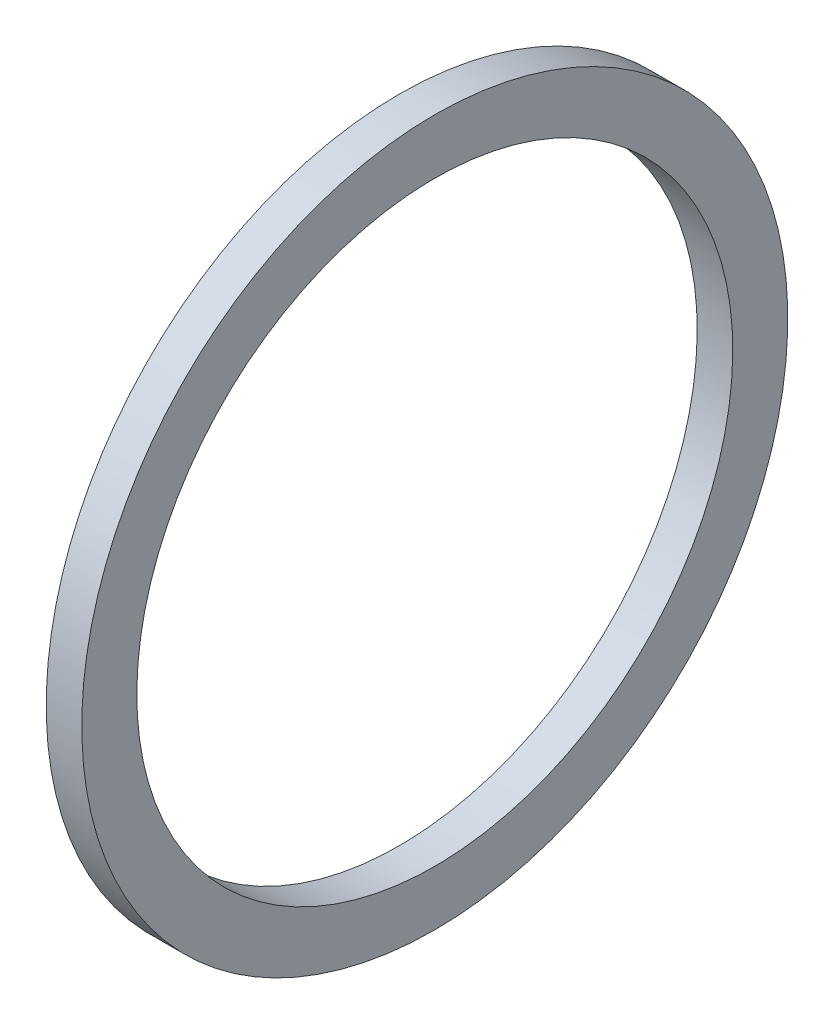
ISO-10303-21;
HEADER;
FILE_DESCRIPTION(('STEP AP214'),'2;1');
FILE_NAME('part.step','',(''),(''),'','','');
FILE_SCHEMA(('AUTOMOTIVE_DESIGN { 1 0 10303 214 1 1 1 1 }'));
ENDSEC;
DATA;
#1=APPLICATION_CONTEXT('core data for automotive mechanical design processes');
#2=APPLICATION_PROTOCOL_DEFINITION('international standard','automotive_design',2000,#1);
#3=PRODUCT_CONTEXT('',#1,'mechanical');
#4=PRODUCT('Part','Part','',(#3));
#5=PRODUCT_RELATED_PRODUCT_CATEGORY('part','',(#4));
#6=PRODUCT_DEFINITION_FORMATION('','',#4);
#7=PRODUCT_DEFINITION_CONTEXT('part definition',#1,'design');
#8=PRODUCT_DEFINITION('design','',#6,#7);
#9=PRODUCT_DEFINITION_SHAPE('','',#8);
#10=(LENGTH_UNIT() NAMED_UNIT(*) SI_UNIT(.MILLI.,.METRE.));
#11=(NAMED_UNIT(*) PLANE_ANGLE_UNIT() SI_UNIT($,.RADIAN.));
#12=(NAMED_UNIT(*) SI_UNIT($,.STERADIAN.) SOLID_ANGLE_UNIT());
#13=UNCERTAINTY_MEASURE_WITH_UNIT(LENGTH_MEASURE(1.E-05),#10,'distance_accuracy_value','');
#14=(GEOMETRIC_REPRESENTATION_CONTEXT(3) GLOBAL_UNCERTAINTY_ASSIGNED_CONTEXT((#13)) GLOBAL_UNIT_ASSIGNED_CONTEXT((#10,
#11,#12)) REPRESENTATION_CONTEXT('',''));
#15=CARTESIAN_POINT('',(0.,0.,0.));
#16=DIRECTION('',(0.,0.,1.));
#17=DIRECTION('',(1.,0.,0.));
#18=AXIS2_PLACEMENT_3D('',#15,#16,#17);
#19=CARTESIAN_POINT('',(8.025,0.,0.));
#20=DIRECTION('',(1.,0.,0.));
#21=DIRECTION('',(0.,0.963910606013732,-0.266226113697059));
#22=AXIS2_PLACEMENT_3D('',#19,#20,#21);
#23=CYLINDRICAL_SURFACE('',#22,14.0989010989011);
#24=CARTESIAN_POINT('',(6.42955682813242,0.,0.));
#25=DIRECTION('',(1.,0.,0.));
#26=DIRECTION('',(0.,0.963910606013732,-0.266226113697059));
#27=AXIS2_PLACEMENT_3D('',#24,#25,#26);
#28=CIRCLE('',#27,14.0989010989011);
#29=CARTESIAN_POINT('',(6.42955682813242,13.5900803023694,-3.75349564695963));
#30=VERTEX_POINT('',#29);
#31=EDGE_CURVE('E31',#30,#30,#28,.T.);
#32=ORIENTED_EDGE('',*,*,#31,.T.);
#33=EDGE_LOOP('',(#32));
#34=FACE_BOUND('',#33,.T.);
#35=CARTESIAN_POINT('',(7.85,0.,0.));
#36=DIRECTION('',(1.,0.,0.));
#37=DIRECTION('',(0.,0.963910606013732,-0.266226113697059));
#38=AXIS2_PLACEMENT_3D('',#35,#36,#37);
#39=CIRCLE('',#38,14.0989010989011);
#40=CARTESIAN_POINT('',(7.85,13.5900803023694,-3.75349564695963));
#41=VERTEX_POINT('',#40);
#42=EDGE_CURVE('E22',#41,#41,#39,.T.);
#43=ORIENTED_EDGE('',*,*,#42,.F.);
#44=EDGE_LOOP('',(#43));
#45=FACE_BOUND('',#44,.T.);
#46=ADVANCED_FACE('F15',(#34,#45),#23,.T.);
#47=CARTESIAN_POINT('',(8.025,0.,0.));
#48=DIRECTION('',(1.,0.,0.));
#49=DIRECTION('',(0.,0.963910606013732,-0.266226113697059));
#50=AXIS2_PLACEMENT_3D('',#47,#48,#49);
#51=CYLINDRICAL_SURFACE('',#50,11.9010989010989);
#52=CARTESIAN_POINT('',(6.42955682813242,0.,0.));
#53=DIRECTION('',(1.,0.,0.));
#54=DIRECTION('',(0.,0.963910606013732,-0.266226113697059));
#55=AXIS2_PLACEMENT_3D('',#52,#53,#54);
#56=CIRCLE('',#55,11.9010989010989);
#57=CARTESIAN_POINT('',(6.42955682813242,11.4715954539876,-3.1683833091639));
#58=VERTEX_POINT('',#57);
#59=EDGE_CURVE('E39',#58,#58,#56,.T.);
#60=ORIENTED_EDGE('',*,*,#59,.F.);
#61=EDGE_LOOP('',(#60));
#62=FACE_BOUND('',#61,.T.);
#63=CARTESIAN_POINT('',(7.85,0.,0.));
#64=DIRECTION('',(1.,0.,0.));
#65=DIRECTION('',(0.,0.963910606013732,-0.266226113697059));
#66=AXIS2_PLACEMENT_3D('',#63,#64,#65);
#67=CIRCLE('',#66,11.9010989010989);
#68=CARTESIAN_POINT('',(7.85,11.4715954539876,-3.1683833091639));
#69=VERTEX_POINT('',#68);
#70=EDGE_CURVE('E10',#69,#69,#67,.T.);
#71=ORIENTED_EDGE('',*,*,#70,.T.);
#72=EDGE_LOOP('',(#71));
#73=FACE_BOUND('',#72,.T.);
#74=ADVANCED_FACE('F49',(#62,#73),#51,.F.);
#75=CARTESIAN_POINT('',(7.85,3.75349564695963,13.5900803023694));
#76=DIRECTION('',(-1.,0.,0.));
#77=DIRECTION('',(0.,0.,1.));
#78=AXIS2_PLACEMENT_3D('',#75,#76,#77);
#79=PLANE('',#78);
#80=ORIENTED_EDGE('',*,*,#70,.F.);
#81=EDGE_LOOP('',(#80));
#82=FACE_BOUND('',#81,.T.);
#83=ORIENTED_EDGE('',*,*,#42,.T.);
#84=EDGE_LOOP('',(#83));
#85=FACE_BOUND('',#84,.T.);
#86=ADVANCED_FACE('F51',(#82,#85),#79,.F.);
#87=CARTESIAN_POINT('',(6.42955682813242,3.75349564695963,13.5900803023694));
#88=DIRECTION('',(1.,0.,0.));
#89=DIRECTION('',(0.,0.,1.));
#90=AXIS2_PLACEMENT_3D('',#87,#88,#89);
#91=PLANE('',#90);
#92=ORIENTED_EDGE('',*,*,#31,.F.);
#93=EDGE_LOOP('',(#92));
#94=FACE_BOUND('',#93,.T.);
#95=ORIENTED_EDGE('',*,*,#59,.T.);
#96=EDGE_LOOP('',(#95));
#97=FACE_BOUND('',#96,.T.);
#98=ADVANCED_FACE('F47',(#94,#97),#91,.F.);
#99=CLOSED_SHELL('',(#46,#74,#86,#98));
#100=MANIFOLD_SOLID_BREP('B1',#99);
#101=ADVANCED_BREP_SHAPE_REPRESENTATION('',(#18,#100),#14);
#102=SHAPE_DEFINITION_REPRESENTATION(#9,#101);
ENDSEC;
END-ISO-10303-21;
